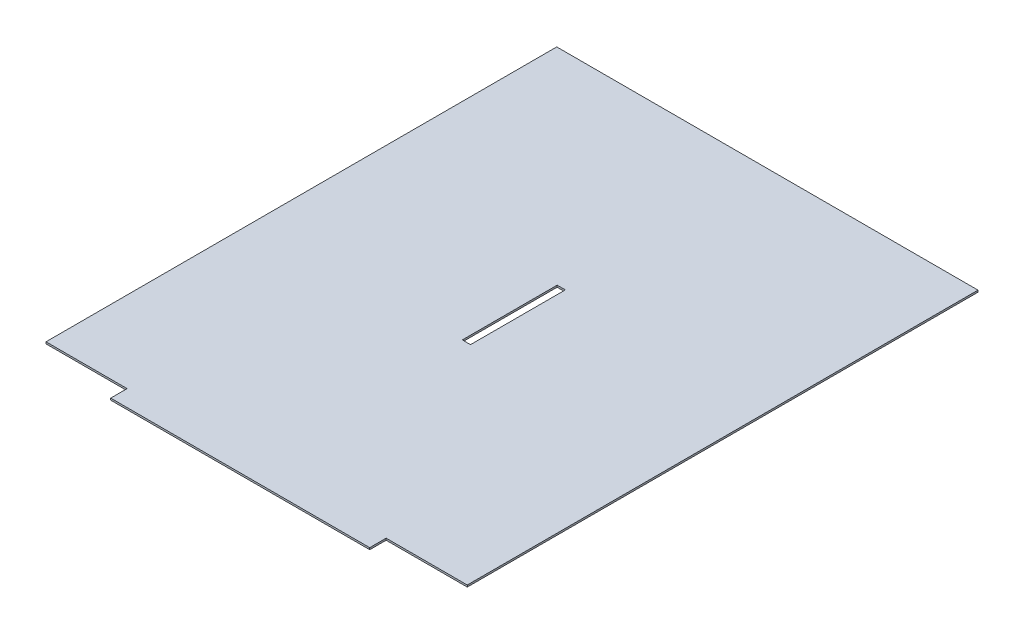
ISO-10303-21;
HEADER;
FILE_DESCRIPTION(('STEP AP214'),'2;1');
FILE_NAME('part.step','',(''),(''),'','','');
FILE_SCHEMA(('AUTOMOTIVE_DESIGN { 1 0 10303 214 1 1 1 1 }'));
ENDSEC;
DATA;
#1=APPLICATION_CONTEXT('core data for automotive mechanical design processes');
#2=APPLICATION_PROTOCOL_DEFINITION('international standard','automotive_design',2000,#1);
#3=PRODUCT_CONTEXT('',#1,'mechanical');
#4=PRODUCT('Part','Part','',(#3));
#5=PRODUCT_RELATED_PRODUCT_CATEGORY('part','',(#4));
#6=PRODUCT_DEFINITION_FORMATION('','',#4);
#7=PRODUCT_DEFINITION_CONTEXT('part definition',#1,'design');
#8=PRODUCT_DEFINITION('design','',#6,#7);
#9=PRODUCT_DEFINITION_SHAPE('','',#8);
#10=(LENGTH_UNIT() NAMED_UNIT(*) SI_UNIT(.MILLI.,.METRE.));
#11=(NAMED_UNIT(*) PLANE_ANGLE_UNIT() SI_UNIT($,.RADIAN.));
#12=(NAMED_UNIT(*) SI_UNIT($,.STERADIAN.) SOLID_ANGLE_UNIT());
#13=UNCERTAINTY_MEASURE_WITH_UNIT(LENGTH_MEASURE(1.E-05),#10,'distance_accuracy_value','');
#14=(GEOMETRIC_REPRESENTATION_CONTEXT(3) GLOBAL_UNCERTAINTY_ASSIGNED_CONTEXT((#13)) GLOBAL_UNIT_ASSIGNED_CONTEXT((#10,
#11,#12)) REPRESENTATION_CONTEXT('',''));
#15=CARTESIAN_POINT('',(0.,0.,0.));
#16=DIRECTION('',(0.,0.,1.));
#17=DIRECTION('',(1.,0.,0.));
#18=AXIS2_PLACEMENT_3D('',#15,#16,#17);
#19=CARTESIAN_POINT('',(115.475,61.,141.));
#20=DIRECTION('',(0.,0.,-1.));
#21=DIRECTION('',(-1.,0.,0.));
#22=AXIS2_PLACEMENT_3D('',#19,#20,#21);
#23=PLANE('',#22);
#24=DIRECTION('',(1.,0.,0.));
#25=VECTOR('',#24,1.);
#26=CARTESIAN_POINT('',(115.475,60.,141.));
#27=LINE('',#26,#25);
#28=CARTESIAN_POINT('',(71.,60.,141.));
#29=VERTEX_POINT('',#28);
#30=CARTESIAN_POINT('',(115.475,60.,141.));
#31=VERTEX_POINT('',#30);
#32=EDGE_CURVE('E152',#29,#31,#27,.T.);
#33=ORIENTED_EDGE('',*,*,#32,.T.);
#34=DIRECTION('',(0.,-1.,0.));
#35=VECTOR('',#34,1.);
#36=CARTESIAN_POINT('',(115.475,61.,141.));
#37=LINE('',#36,#35);
#38=CARTESIAN_POINT('',(115.475,61.,141.));
#39=VERTEX_POINT('',#38);
#40=EDGE_CURVE('E209',#39,#31,#37,.T.);
#41=ORIENTED_EDGE('',*,*,#40,.F.);
#42=DIRECTION('',(1.,0.,0.));
#43=VECTOR('',#42,1.);
#44=CARTESIAN_POINT('',(115.475,61.,141.));
#45=LINE('',#44,#43);
#46=CARTESIAN_POINT('',(71.,61.,141.));
#47=VERTEX_POINT('',#46);
#48=EDGE_CURVE('E155',#47,#39,#45,.T.);
#49=ORIENTED_EDGE('',*,*,#48,.F.);
#50=DIRECTION('',(0.,-1.,0.));
#51=VECTOR('',#50,1.);
#52=CARTESIAN_POINT('',(71.,61.,141.));
#53=LINE('',#52,#51);
#54=EDGE_CURVE('E173',#47,#29,#53,.T.);
#55=ORIENTED_EDGE('',*,*,#54,.T.);
#56=EDGE_LOOP('',(#33,#41,#49,#55));
#57=FACE_BOUND('',#56,.T.);
#58=ADVANCED_FACE('F39',(#57),#23,.F.);
#59=CARTESIAN_POINT('',(115.475,61.,141.));
#60=DIRECTION('',(-1.,0.,0.));
#61=DIRECTION('',(0.,0.,1.));
#62=AXIS2_PLACEMENT_3D('',#59,#60,#61);
#63=PLANE('',#62);
#64=DIRECTION('',(0.,0.,-1.));
#65=VECTOR('',#64,1.);
#66=CARTESIAN_POINT('',(115.475,60.,141.));
#67=LINE('',#66,#65);
#68=CARTESIAN_POINT('',(115.475,60.,-139.));
#69=VERTEX_POINT('',#68);
#70=EDGE_CURVE('E176',#31,#69,#67,.T.);
#71=ORIENTED_EDGE('',*,*,#70,.T.);
#72=DIRECTION('',(0.,-1.,0.));
#73=VECTOR('',#72,1.);
#74=CARTESIAN_POINT('',(115.475,61.,-139.));
#75=LINE('',#74,#73);
#76=CARTESIAN_POINT('',(115.475,61.,-139.));
#77=VERTEX_POINT('',#76);
#78=EDGE_CURVE('E206',#77,#69,#75,.T.);
#79=ORIENTED_EDGE('',*,*,#78,.F.);
#80=DIRECTION('',(0.,0.,-1.));
#81=VECTOR('',#80,1.);
#82=CARTESIAN_POINT('',(115.475,61.,141.));
#83=LINE('',#82,#81);
#84=EDGE_CURVE('E158',#39,#77,#83,.T.);
#85=ORIENTED_EDGE('',*,*,#84,.F.);
#86=ORIENTED_EDGE('',*,*,#40,.T.);
#87=EDGE_LOOP('',(#71,#79,#85,#86));
#88=FACE_BOUND('',#87,.T.);
#89=ADVANCED_FACE('F234',(#88),#63,.F.);
#90=CARTESIAN_POINT('',(-115.475,61.,-139.));
#91=DIRECTION('',(0.,0.,1.));
#92=DIRECTION('',(1.,0.,0.));
#93=AXIS2_PLACEMENT_3D('',#90,#91,#92);
#94=PLANE('',#93);
#95=DIRECTION('',(-1.,0.,0.));
#96=VECTOR('',#95,1.);
#97=CARTESIAN_POINT('',(-115.475,60.,-139.));
#98=LINE('',#97,#96);
#99=CARTESIAN_POINT('',(-115.475,60.,-139.));
#100=VERTEX_POINT('',#99);
#101=EDGE_CURVE('E178',#69,#100,#98,.T.);
#102=ORIENTED_EDGE('',*,*,#101,.T.);
#103=DIRECTION('',(0.,-1.,0.));
#104=VECTOR('',#103,1.);
#105=CARTESIAN_POINT('',(-115.475,61.,-139.));
#106=LINE('',#105,#104);
#107=CARTESIAN_POINT('',(-115.475,61.,-139.));
#108=VERTEX_POINT('',#107);
#109=EDGE_CURVE('E203',#108,#100,#106,.T.);
#110=ORIENTED_EDGE('',*,*,#109,.F.);
#111=DIRECTION('',(-1.,0.,0.));
#112=VECTOR('',#111,1.);
#113=CARTESIAN_POINT('',(-115.475,61.,-139.));
#114=LINE('',#113,#112);
#115=EDGE_CURVE('E161',#77,#108,#114,.T.);
#116=ORIENTED_EDGE('',*,*,#115,.F.);
#117=ORIENTED_EDGE('',*,*,#78,.T.);
#118=EDGE_LOOP('',(#102,#110,#116,#117));
#119=FACE_BOUND('',#118,.T.);
#120=ADVANCED_FACE('F239',(#119),#94,.F.);
#121=CARTESIAN_POINT('',(-115.475,61.,141.));
#122=DIRECTION('',(1.,0.,0.));
#123=DIRECTION('',(0.,0.,-1.));
#124=AXIS2_PLACEMENT_3D('',#121,#122,#123);
#125=PLANE('',#124);
#126=DIRECTION('',(0.,0.,1.));
#127=VECTOR('',#126,1.);
#128=CARTESIAN_POINT('',(-115.475,60.,141.));
#129=LINE('',#128,#127);
#130=CARTESIAN_POINT('',(-115.475,60.,141.));
#131=VERTEX_POINT('',#130);
#132=EDGE_CURVE('E180',#100,#131,#129,.T.);
#133=ORIENTED_EDGE('',*,*,#132,.T.);
#134=DIRECTION('',(0.,-1.,0.));
#135=VECTOR('',#134,1.);
#136=CARTESIAN_POINT('',(-115.475,61.,141.));
#137=LINE('',#136,#135);
#138=CARTESIAN_POINT('',(-115.475,61.,141.));
#139=VERTEX_POINT('',#138);
#140=EDGE_CURVE('E200',#139,#131,#137,.T.);
#141=ORIENTED_EDGE('',*,*,#140,.F.);
#142=DIRECTION('',(0.,0.,1.));
#143=VECTOR('',#142,1.);
#144=CARTESIAN_POINT('',(-115.475,61.,141.));
#145=LINE('',#144,#143);
#146=EDGE_CURVE('E163',#108,#139,#145,.T.);
#147=ORIENTED_EDGE('',*,*,#146,.F.);
#148=ORIENTED_EDGE('',*,*,#109,.T.);
#149=EDGE_LOOP('',(#133,#141,#147,#148));
#150=FACE_BOUND('',#149,.T.);
#151=ADVANCED_FACE('F271',(#150),#125,.F.);
#152=CARTESIAN_POINT('',(-115.475,61.,141.));
#153=DIRECTION('',(0.,0.,-1.));
#154=DIRECTION('',(-1.,0.,0.));
#155=AXIS2_PLACEMENT_3D('',#152,#153,#154);
#156=PLANE('',#155);
#157=DIRECTION('',(1.,0.,0.));
#158=VECTOR('',#157,1.);
#159=CARTESIAN_POINT('',(-115.475,60.,141.));
#160=LINE('',#159,#158);
#161=CARTESIAN_POINT('',(-71.,60.,141.));
#162=VERTEX_POINT('',#161);
#163=EDGE_CURVE('E182',#131,#162,#160,.T.);
#164=ORIENTED_EDGE('',*,*,#163,.T.);
#165=DIRECTION('',(0.,-1.,0.));
#166=VECTOR('',#165,1.);
#167=CARTESIAN_POINT('',(-71.,61.,141.));
#168=LINE('',#167,#166);
#169=CARTESIAN_POINT('',(-71.,61.,141.));
#170=VERTEX_POINT('',#169);
#171=EDGE_CURVE('E197',#170,#162,#168,.T.);
#172=ORIENTED_EDGE('',*,*,#171,.F.);
#173=DIRECTION('',(1.,0.,0.));
#174=VECTOR('',#173,1.);
#175=CARTESIAN_POINT('',(-115.475,61.,141.));
#176=LINE('',#175,#174);
#177=EDGE_CURVE('E165',#139,#170,#176,.T.);
#178=ORIENTED_EDGE('',*,*,#177,.F.);
#179=ORIENTED_EDGE('',*,*,#140,.T.);
#180=EDGE_LOOP('',(#164,#172,#178,#179));
#181=FACE_BOUND('',#180,.T.);
#182=ADVANCED_FACE('F267',(#181),#156,.F.);
#183=CARTESIAN_POINT('',(-71.,61.,150.));
#184=DIRECTION('',(1.,0.,0.));
#185=DIRECTION('',(0.,0.,-1.));
#186=AXIS2_PLACEMENT_3D('',#183,#184,#185);
#187=PLANE('',#186);
#188=DIRECTION('',(0.,0.,1.));
#189=VECTOR('',#188,1.);
#190=CARTESIAN_POINT('',(-71.,60.,150.));
#191=LINE('',#190,#189);
#192=CARTESIAN_POINT('',(-71.,60.,150.));
#193=VERTEX_POINT('',#192);
#194=EDGE_CURVE('E184',#162,#193,#191,.T.);
#195=ORIENTED_EDGE('',*,*,#194,.T.);
#196=DIRECTION('',(0.,-1.,0.));
#197=VECTOR('',#196,1.);
#198=CARTESIAN_POINT('',(-71.,61.,150.));
#199=LINE('',#198,#197);
#200=CARTESIAN_POINT('',(-71.,61.,150.));
#201=VERTEX_POINT('',#200);
#202=EDGE_CURVE('E194',#201,#193,#199,.T.);
#203=ORIENTED_EDGE('',*,*,#202,.F.);
#204=DIRECTION('',(0.,0.,1.));
#205=VECTOR('',#204,1.);
#206=CARTESIAN_POINT('',(-71.,61.,150.));
#207=LINE('',#206,#205);
#208=EDGE_CURVE('E167',#170,#201,#207,.T.);
#209=ORIENTED_EDGE('',*,*,#208,.F.);
#210=ORIENTED_EDGE('',*,*,#171,.T.);
#211=EDGE_LOOP('',(#195,#203,#209,#210));
#212=FACE_BOUND('',#211,.T.);
#213=ADVANCED_FACE('F262',(#212),#187,.F.);
#214=CARTESIAN_POINT('',(-71.,61.,150.));
#215=DIRECTION('',(0.,0.,-1.));
#216=DIRECTION('',(-1.,0.,0.));
#217=AXIS2_PLACEMENT_3D('',#214,#215,#216);
#218=PLANE('',#217);
#219=DIRECTION('',(1.,0.,0.));
#220=VECTOR('',#219,1.);
#221=CARTESIAN_POINT('',(-71.,60.,150.));
#222=LINE('',#221,#220);
#223=CARTESIAN_POINT('',(71.,60.,150.));
#224=VERTEX_POINT('',#223);
#225=EDGE_CURVE('E186',#193,#224,#222,.T.);
#226=ORIENTED_EDGE('',*,*,#225,.T.);
#227=DIRECTION('',(0.,-1.,0.));
#228=VECTOR('',#227,1.);
#229=CARTESIAN_POINT('',(71.,61.,150.));
#230=LINE('',#229,#228);
#231=CARTESIAN_POINT('',(71.,61.,150.));
#232=VERTEX_POINT('',#231);
#233=EDGE_CURVE('E191',#232,#224,#230,.T.);
#234=ORIENTED_EDGE('',*,*,#233,.F.);
#235=DIRECTION('',(1.,0.,0.));
#236=VECTOR('',#235,1.);
#237=CARTESIAN_POINT('',(-71.,61.,150.));
#238=LINE('',#237,#236);
#239=EDGE_CURVE('E169',#201,#232,#238,.T.);
#240=ORIENTED_EDGE('',*,*,#239,.F.);
#241=ORIENTED_EDGE('',*,*,#202,.T.);
#242=EDGE_LOOP('',(#226,#234,#240,#241));
#243=FACE_BOUND('',#242,.T.);
#244=ADVANCED_FACE('F257',(#243),#218,.F.);
#245=CARTESIAN_POINT('',(71.,61.,150.));
#246=DIRECTION('',(-1.,0.,0.));
#247=DIRECTION('',(0.,0.,1.));
#248=AXIS2_PLACEMENT_3D('',#245,#246,#247);
#249=PLANE('',#248);
#250=DIRECTION('',(0.,0.,-1.));
#251=VECTOR('',#250,1.);
#252=CARTESIAN_POINT('',(71.,60.,150.));
#253=LINE('',#252,#251);
#254=EDGE_CURVE('E159',#224,#29,#253,.T.);
#255=ORIENTED_EDGE('',*,*,#254,.T.);
#256=ORIENTED_EDGE('',*,*,#54,.F.);
#257=DIRECTION('',(0.,0.,-1.));
#258=VECTOR('',#257,1.);
#259=CARTESIAN_POINT('',(71.,61.,150.));
#260=LINE('',#259,#258);
#261=EDGE_CURVE('E171',#232,#47,#260,.T.);
#262=ORIENTED_EDGE('',*,*,#261,.F.);
#263=ORIENTED_EDGE('',*,*,#233,.T.);
#264=EDGE_LOOP('',(#255,#256,#262,#263));
#265=FACE_BOUND('',#264,.T.);
#266=ADVANCED_FACE('F255',(#265),#249,.F.);
#267=CARTESIAN_POINT('',(0.,61.,0.));
#268=DIRECTION('',(0.,-1.,0.));
#269=DIRECTION('',(0.,0.,-1.));
#270=AXIS2_PLACEMENT_3D('',#267,#268,#269);
#271=PLANE('',#270);
#272=DIRECTION('',(-1.,0.,0.));
#273=VECTOR('',#272,1.);
#274=CARTESIAN_POINT('',(-2.25,61.,-26.));
#275=LINE('',#274,#273);
#276=CARTESIAN_POINT('',(2.25,61.,-26.));
#277=VERTEX_POINT('',#276);
#278=CARTESIAN_POINT('',(-2.25,61.,-26.));
#279=VERTEX_POINT('',#278);
#280=EDGE_CURVE('E138',#277,#279,#275,.T.);
#281=ORIENTED_EDGE('',*,*,#280,.F.);
#282=DIRECTION('',(0.,0.,-1.));
#283=VECTOR('',#282,1.);
#284=CARTESIAN_POINT('',(2.25,61.,-26.));
#285=LINE('',#284,#283);
#286=CARTESIAN_POINT('',(2.25,61.,26.));
#287=VERTEX_POINT('',#286);
#288=EDGE_CURVE('E53',#287,#277,#285,.T.);
#289=ORIENTED_EDGE('',*,*,#288,.F.);
#290=DIRECTION('',(1.,0.,0.));
#291=VECTOR('',#290,1.);
#292=CARTESIAN_POINT('',(-2.25,61.,26.));
#293=LINE('',#292,#291);
#294=CARTESIAN_POINT('',(-2.25,61.,26.));
#295=VERTEX_POINT('',#294);
#296=EDGE_CURVE('E145',#295,#287,#293,.T.);
#297=ORIENTED_EDGE('',*,*,#296,.F.);
#298=DIRECTION('',(0.,0.,1.));
#299=VECTOR('',#298,1.);
#300=CARTESIAN_POINT('',(-2.25,61.,-26.));
#301=LINE('',#300,#299);
#302=EDGE_CURVE('E129',#279,#295,#301,.T.);
#303=ORIENTED_EDGE('',*,*,#302,.F.);
#304=EDGE_LOOP('',(#281,#289,#297,#303));
#305=FACE_BOUND('',#304,.T.);
#306=ORIENTED_EDGE('',*,*,#48,.T.);
#307=ORIENTED_EDGE('',*,*,#84,.T.);
#308=ORIENTED_EDGE('',*,*,#115,.T.);
#309=ORIENTED_EDGE('',*,*,#146,.T.);
#310=ORIENTED_EDGE('',*,*,#177,.T.);
#311=ORIENTED_EDGE('',*,*,#208,.T.);
#312=ORIENTED_EDGE('',*,*,#239,.T.);
#313=ORIENTED_EDGE('',*,*,#261,.T.);
#314=EDGE_LOOP('',(#306,#307,#308,#309,#310,#311,#312,#313));
#315=FACE_BOUND('',#314,.T.);
#316=ADVANCED_FACE('F142',(#305,#315),#271,.F.);
#317=CARTESIAN_POINT('',(0.,60.,0.));
#318=DIRECTION('',(0.,-1.,0.));
#319=DIRECTION('',(0.,0.,-1.));
#320=AXIS2_PLACEMENT_3D('',#317,#318,#319);
#321=PLANE('',#320);
#322=DIRECTION('',(0.,0.,1.));
#323=VECTOR('',#322,1.);
#324=CARTESIAN_POINT('',(2.25,60.,0.));
#325=LINE('',#324,#323);
#326=CARTESIAN_POINT('',(2.25,60.,-26.));
#327=VERTEX_POINT('',#326);
#328=CARTESIAN_POINT('',(2.25,60.,26.));
#329=VERTEX_POINT('',#328);
#330=EDGE_CURVE('E11',#327,#329,#325,.T.);
#331=ORIENTED_EDGE('',*,*,#330,.F.);
#332=DIRECTION('',(1.,0.,0.));
#333=VECTOR('',#332,1.);
#334=CARTESIAN_POINT('',(0.,60.,-26.));
#335=LINE('',#334,#333);
#336=CARTESIAN_POINT('',(-2.25,60.,-26.));
#337=VERTEX_POINT('',#336);
#338=EDGE_CURVE('E212',#337,#327,#335,.T.);
#339=ORIENTED_EDGE('',*,*,#338,.F.);
#340=DIRECTION('',(0.,0.,-1.));
#341=VECTOR('',#340,1.);
#342=CARTESIAN_POINT('',(-2.25,60.,0.));
#343=LINE('',#342,#341);
#344=CARTESIAN_POINT('',(-2.25,60.,26.));
#345=VERTEX_POINT('',#344);
#346=EDGE_CURVE('E132',#345,#337,#343,.T.);
#347=ORIENTED_EDGE('',*,*,#346,.F.);
#348=DIRECTION('',(-1.,0.,0.));
#349=VECTOR('',#348,1.);
#350=CARTESIAN_POINT('',(0.,60.,26.));
#351=LINE('',#350,#349);
#352=EDGE_CURVE('E46',#329,#345,#351,.T.);
#353=ORIENTED_EDGE('',*,*,#352,.F.);
#354=EDGE_LOOP('',(#331,#339,#347,#353));
#355=FACE_BOUND('',#354,.T.);
#356=ORIENTED_EDGE('',*,*,#32,.F.);
#357=ORIENTED_EDGE('',*,*,#254,.F.);
#358=ORIENTED_EDGE('',*,*,#225,.F.);
#359=ORIENTED_EDGE('',*,*,#194,.F.);
#360=ORIENTED_EDGE('',*,*,#163,.F.);
#361=ORIENTED_EDGE('',*,*,#132,.F.);
#362=ORIENTED_EDGE('',*,*,#101,.F.);
#363=ORIENTED_EDGE('',*,*,#70,.F.);
#364=EDGE_LOOP('',(#356,#357,#358,#359,#360,#361,#362,#363));
#365=FACE_BOUND('',#364,.T.);
#366=ADVANCED_FACE('F220',(#355,#365),#321,.T.);
#367=CARTESIAN_POINT('',(2.25,51.,-26.));
#368=DIRECTION('',(1.,0.,0.));
#369=DIRECTION('',(0.,0.,-1.));
#370=AXIS2_PLACEMENT_3D('',#367,#368,#369);
#371=PLANE('',#370);
#372=ORIENTED_EDGE('',*,*,#330,.T.);
#373=DIRECTION('',(0.,1.,0.));
#374=VECTOR('',#373,1.);
#375=CARTESIAN_POINT('',(2.25,51.,26.));
#376=LINE('',#375,#374);
#377=EDGE_CURVE('E150',#329,#287,#376,.T.);
#378=ORIENTED_EDGE('',*,*,#377,.T.);
#379=ORIENTED_EDGE('',*,*,#288,.T.);
#380=DIRECTION('',(0.,1.,0.));
#381=VECTOR('',#380,1.);
#382=CARTESIAN_POINT('',(2.25,51.,-26.));
#383=LINE('',#382,#381);
#384=EDGE_CURVE('E135',#327,#277,#383,.T.);
#385=ORIENTED_EDGE('',*,*,#384,.F.);
#386=EDGE_LOOP('',(#372,#378,#379,#385));
#387=FACE_BOUND('',#386,.T.);
#388=ADVANCED_FACE('F222',(#387),#371,.F.);
#389=CARTESIAN_POINT('',(-2.25,51.,26.));
#390=DIRECTION('',(0.,0.,1.));
#391=DIRECTION('',(1.,0.,0.));
#392=AXIS2_PLACEMENT_3D('',#389,#390,#391);
#393=PLANE('',#392);
#394=ORIENTED_EDGE('',*,*,#352,.T.);
#395=DIRECTION('',(0.,1.,0.));
#396=VECTOR('',#395,1.);
#397=CARTESIAN_POINT('',(-2.25,51.,26.));
#398=LINE('',#397,#396);
#399=EDGE_CURVE('E134',#345,#295,#398,.T.);
#400=ORIENTED_EDGE('',*,*,#399,.T.);
#401=ORIENTED_EDGE('',*,*,#296,.T.);
#402=ORIENTED_EDGE('',*,*,#377,.F.);
#403=EDGE_LOOP('',(#394,#400,#401,#402));
#404=FACE_BOUND('',#403,.T.);
#405=ADVANCED_FACE('F217',(#404),#393,.F.);
#406=CARTESIAN_POINT('',(-2.25,51.,-26.));
#407=DIRECTION('',(-1.,0.,0.));
#408=DIRECTION('',(0.,0.,1.));
#409=AXIS2_PLACEMENT_3D('',#406,#407,#408);
#410=PLANE('',#409);
#411=ORIENTED_EDGE('',*,*,#346,.T.);
#412=DIRECTION('',(0.,1.,0.));
#413=VECTOR('',#412,1.);
#414=CARTESIAN_POINT('',(-2.25,51.,-26.));
#415=LINE('',#414,#413);
#416=EDGE_CURVE('E61',#337,#279,#415,.T.);
#417=ORIENTED_EDGE('',*,*,#416,.T.);
#418=ORIENTED_EDGE('',*,*,#302,.T.);
#419=ORIENTED_EDGE('',*,*,#399,.F.);
#420=EDGE_LOOP('',(#411,#417,#418,#419));
#421=FACE_BOUND('',#420,.T.);
#422=ADVANCED_FACE('F126',(#421),#410,.F.);
#423=CARTESIAN_POINT('',(-2.25,51.,-26.));
#424=DIRECTION('',(0.,0.,-1.));
#425=DIRECTION('',(-1.,0.,0.));
#426=AXIS2_PLACEMENT_3D('',#423,#424,#425);
#427=PLANE('',#426);
#428=ORIENTED_EDGE('',*,*,#338,.T.);
#429=ORIENTED_EDGE('',*,*,#384,.T.);
#430=ORIENTED_EDGE('',*,*,#280,.T.);
#431=ORIENTED_EDGE('',*,*,#416,.F.);
#432=EDGE_LOOP('',(#428,#429,#430,#431));
#433=FACE_BOUND('',#432,.T.);
#434=ADVANCED_FACE('F139',(#433),#427,.F.);
#435=CLOSED_SHELL('',(#58,#89,#120,#151,#182,#213,#244,#266,#316,#366,#388,#405,#422,#434));
#436=MANIFOLD_SOLID_BREP('B2',#435);
#437=ADVANCED_BREP_SHAPE_REPRESENTATION('',(#18,#436),#14);
#438=SHAPE_DEFINITION_REPRESENTATION(#9,#437);
ENDSEC;
END-ISO-10303-21;
